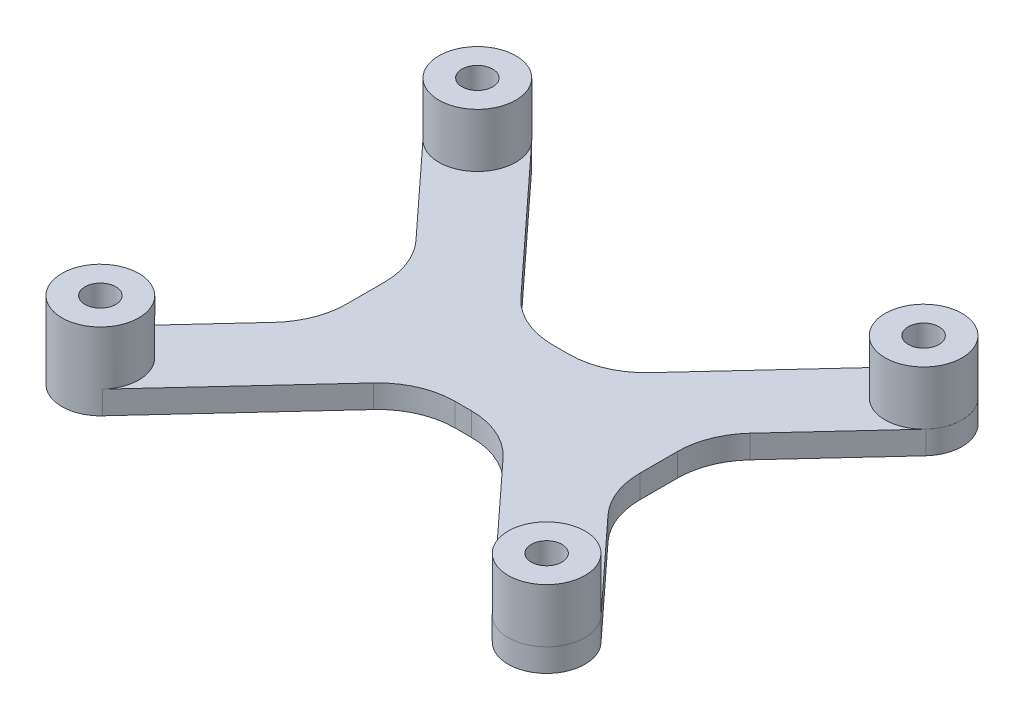
ISO-10303-21;
HEADER;
FILE_DESCRIPTION(('STEP AP214'),'2;1');
FILE_NAME('part.step','',(''),(''),'','','');
FILE_SCHEMA(('AUTOMOTIVE_DESIGN { 1 0 10303 214 1 1 1 1 }'));
ENDSEC;
DATA;
#1=APPLICATION_CONTEXT('core data for automotive mechanical design processes');
#2=APPLICATION_PROTOCOL_DEFINITION('international standard','automotive_design',2000,#1);
#3=PRODUCT_CONTEXT('',#1,'mechanical');
#4=PRODUCT('Part','Part','',(#3));
#5=PRODUCT_RELATED_PRODUCT_CATEGORY('part','',(#4));
#6=PRODUCT_DEFINITION_FORMATION('','',#4);
#7=PRODUCT_DEFINITION_CONTEXT('part definition',#1,'design');
#8=PRODUCT_DEFINITION('design','',#6,#7);
#9=PRODUCT_DEFINITION_SHAPE('','',#8);
#10=(LENGTH_UNIT() NAMED_UNIT(*) SI_UNIT(.MILLI.,.METRE.));
#11=(NAMED_UNIT(*) PLANE_ANGLE_UNIT() SI_UNIT($,.RADIAN.));
#12=(NAMED_UNIT(*) SI_UNIT($,.STERADIAN.) SOLID_ANGLE_UNIT());
#13=UNCERTAINTY_MEASURE_WITH_UNIT(LENGTH_MEASURE(1.E-05),#10,'distance_accuracy_value','');
#14=(GEOMETRIC_REPRESENTATION_CONTEXT(3) GLOBAL_UNCERTAINTY_ASSIGNED_CONTEXT((#13)) GLOBAL_UNIT_ASSIGNED_CONTEXT((#10,
#11,#12)) REPRESENTATION_CONTEXT('',''));
#15=CARTESIAN_POINT('',(0.,0.,0.));
#16=DIRECTION('',(0.,0.,1.));
#17=DIRECTION('',(1.,0.,0.));
#18=AXIS2_PLACEMENT_3D('',#15,#16,#17);
#19=CARTESIAN_POINT('',(29.,7.,24.5));
#20=DIRECTION('',(0.,-1.,0.));
#21=DIRECTION('',(0.,0.,-1.));
#22=AXIS2_PLACEMENT_3D('',#19,#20,#21);
#23=CYLINDRICAL_SURFACE('',#22,5.);
#24=CARTESIAN_POINT('',(29.,7.,24.5));
#25=DIRECTION('',(0.,1.,0.));
#26=DIRECTION('',(0.,0.,1.));
#27=AXIS2_PLACEMENT_3D('',#24,#25,#26);
#28=CIRCLE('',#27,5.);
#29=CARTESIAN_POINT('',(29.,7.,29.5));
#30=VERTEX_POINT('',#29);
#31=EDGE_CURVE('E56',#30,#30,#28,.T.);
#32=ORIENTED_EDGE('',*,*,#31,.F.);
#33=EDGE_LOOP('',(#32));
#34=FACE_BOUND('',#33,.T.);
#35=CARTESIAN_POINT('',(29.,0.,24.5));
#36=DIRECTION('',(0.,1.,0.));
#37=DIRECTION('',(0.,0.,1.));
#38=AXIS2_PLACEMENT_3D('',#35,#36,#37);
#39=CIRCLE('',#38,5.);
#40=CARTESIAN_POINT('',(29.,0.,29.5));
#41=VERTEX_POINT('',#40);
#42=EDGE_CURVE('E11',#41,#41,#39,.T.);
#43=ORIENTED_EDGE('',*,*,#42,.T.);
#44=EDGE_LOOP('',(#43));
#45=FACE_BOUND('',#44,.T.);
#46=ADVANCED_FACE('F52',(#34,#45),#23,.T.);
#47=CARTESIAN_POINT('',(29.,7.,24.5));
#48=DIRECTION('',(0.,1.,0.));
#49=DIRECTION('',(0.,0.,1.));
#50=AXIS2_PLACEMENT_3D('',#47,#48,#49);
#51=PLANE('',#50);
#52=CARTESIAN_POINT('',(29.,7.,24.5));
#53=DIRECTION('',(0.,1.,0.));
#54=DIRECTION('',(0.,0.,1.));
#55=AXIS2_PLACEMENT_3D('',#52,#53,#54);
#56=CIRCLE('',#55,2.);
#57=CARTESIAN_POINT('',(29.,7.,26.5));
#58=VERTEX_POINT('',#57);
#59=EDGE_CURVE('E63',#58,#58,#56,.T.);
#60=ORIENTED_EDGE('',*,*,#59,.F.);
#61=EDGE_LOOP('',(#60));
#62=FACE_BOUND('',#61,.T.);
#63=ORIENTED_EDGE('',*,*,#31,.T.);
#64=EDGE_LOOP('',(#63));
#65=FACE_BOUND('',#64,.T.);
#66=ADVANCED_FACE('F54',(#62,#65),#51,.T.);
#67=CARTESIAN_POINT('',(29.,0.,24.5));
#68=DIRECTION('',(0.,1.,0.));
#69=DIRECTION('',(0.,0.,1.));
#70=AXIS2_PLACEMENT_3D('',#67,#68,#69);
#71=PLANE('',#70);
#72=ORIENTED_EDGE('',*,*,#42,.F.);
#73=EDGE_LOOP('',(#72));
#74=FACE_BOUND('',#73,.T.);
#75=ADVANCED_FACE('F75',(#74),#71,.F.);
#76=CARTESIAN_POINT('',(29.,2.2,24.5));
#77=DIRECTION('',(0.,1.,0.));
#78=DIRECTION('',(0.,0.,1.));
#79=AXIS2_PLACEMENT_3D('',#76,#77,#78);
#80=CYLINDRICAL_SURFACE('',#79,2.);
#81=CARTESIAN_POINT('',(29.,2.2,24.5));
#82=DIRECTION('',(0.,1.,0.));
#83=DIRECTION('',(0.,0.,1.));
#84=AXIS2_PLACEMENT_3D('',#81,#82,#83);
#85=CIRCLE('',#84,2.);
#86=CARTESIAN_POINT('',(29.,2.2,26.5));
#87=VERTEX_POINT('',#86);
#88=EDGE_CURVE('E65',#87,#87,#85,.T.);
#89=ORIENTED_EDGE('',*,*,#88,.F.);
#90=EDGE_LOOP('',(#89));
#91=FACE_BOUND('',#90,.T.);
#92=ORIENTED_EDGE('',*,*,#59,.T.);
#93=EDGE_LOOP('',(#92));
#94=FACE_BOUND('',#93,.T.);
#95=ADVANCED_FACE('F71',(#91,#94),#80,.F.);
#96=CARTESIAN_POINT('',(29.,2.2,24.5));
#97=DIRECTION('',(0.,1.,0.));
#98=DIRECTION('',(0.,0.,1.));
#99=AXIS2_PLACEMENT_3D('',#96,#97,#98);
#100=PLANE('',#99);
#101=ORIENTED_EDGE('',*,*,#88,.T.);
#102=EDGE_LOOP('',(#101));
#103=FACE_BOUND('',#102,.T.);
#104=ADVANCED_FACE('F83',(#103),#100,.T.);
#105=CLOSED_SHELL('',(#46,#66,#75,#95,#104));
#106=MANIFOLD_SOLID_BREP('B2',#105);
#107=CARTESIAN_POINT('',(29.,7.,-24.5));
#108=DIRECTION('',(0.,-1.,0.));
#109=DIRECTION('',(0.,0.,-1.));
#110=AXIS2_PLACEMENT_3D('',#107,#108,#109);
#111=CYLINDRICAL_SURFACE('',#110,5.);
#112=CARTESIAN_POINT('',(29.,7.,-24.5));
#113=DIRECTION('',(0.,1.,0.));
#114=DIRECTION('',(0.,0.,1.));
#115=AXIS2_PLACEMENT_3D('',#112,#113,#114);
#116=CIRCLE('',#115,5.);
#117=CARTESIAN_POINT('',(29.,7.,-19.5));
#118=VERTEX_POINT('',#117);
#119=EDGE_CURVE('E147',#118,#118,#116,.T.);
#120=ORIENTED_EDGE('',*,*,#119,.F.);
#121=EDGE_LOOP('',(#120));
#122=FACE_BOUND('',#121,.T.);
#123=CARTESIAN_POINT('',(29.,0.,-24.5));
#124=DIRECTION('',(0.,1.,0.));
#125=DIRECTION('',(0.,0.,1.));
#126=AXIS2_PLACEMENT_3D('',#123,#124,#125);
#127=CIRCLE('',#126,5.);
#128=CARTESIAN_POINT('',(29.,0.,-19.5));
#129=VERTEX_POINT('',#128);
#130=EDGE_CURVE('E51',#129,#129,#127,.T.);
#131=ORIENTED_EDGE('',*,*,#130,.T.);
#132=EDGE_LOOP('',(#131));
#133=FACE_BOUND('',#132,.T.);
#134=ADVANCED_FACE('F143',(#122,#133),#111,.T.);
#135=CARTESIAN_POINT('',(29.,7.,-24.5));
#136=DIRECTION('',(0.,1.,0.));
#137=DIRECTION('',(0.,0.,1.));
#138=AXIS2_PLACEMENT_3D('',#135,#136,#137);
#139=PLANE('',#138);
#140=CARTESIAN_POINT('',(29.,7.,-24.5));
#141=DIRECTION('',(0.,1.,0.));
#142=DIRECTION('',(0.,0.,1.));
#143=AXIS2_PLACEMENT_3D('',#140,#141,#142);
#144=CIRCLE('',#143,2.);
#145=CARTESIAN_POINT('',(29.,7.,-22.5));
#146=VERTEX_POINT('',#145);
#147=EDGE_CURVE('E154',#146,#146,#144,.T.);
#148=ORIENTED_EDGE('',*,*,#147,.F.);
#149=EDGE_LOOP('',(#148));
#150=FACE_BOUND('',#149,.T.);
#151=ORIENTED_EDGE('',*,*,#119,.T.);
#152=EDGE_LOOP('',(#151));
#153=FACE_BOUND('',#152,.T.);
#154=ADVANCED_FACE('F145',(#150,#153),#139,.T.);
#155=CARTESIAN_POINT('',(29.,0.,-24.5));
#156=DIRECTION('',(0.,1.,0.));
#157=DIRECTION('',(0.,0.,1.));
#158=AXIS2_PLACEMENT_3D('',#155,#156,#157);
#159=PLANE('',#158);
#160=ORIENTED_EDGE('',*,*,#130,.F.);
#161=EDGE_LOOP('',(#160));
#162=FACE_BOUND('',#161,.T.);
#163=ADVANCED_FACE('F166',(#162),#159,.F.);
#164=CARTESIAN_POINT('',(29.,2.2,-24.5));
#165=DIRECTION('',(0.,1.,0.));
#166=DIRECTION('',(0.,0.,1.));
#167=AXIS2_PLACEMENT_3D('',#164,#165,#166);
#168=CYLINDRICAL_SURFACE('',#167,2.);
#169=CARTESIAN_POINT('',(29.,2.2,-24.5));
#170=DIRECTION('',(0.,1.,0.));
#171=DIRECTION('',(0.,0.,1.));
#172=AXIS2_PLACEMENT_3D('',#169,#170,#171);
#173=CIRCLE('',#172,2.);
#174=CARTESIAN_POINT('',(29.,2.2,-22.5));
#175=VERTEX_POINT('',#174);
#176=EDGE_CURVE('E156',#175,#175,#173,.T.);
#177=ORIENTED_EDGE('',*,*,#176,.F.);
#178=EDGE_LOOP('',(#177));
#179=FACE_BOUND('',#178,.T.);
#180=ORIENTED_EDGE('',*,*,#147,.T.);
#181=EDGE_LOOP('',(#180));
#182=FACE_BOUND('',#181,.T.);
#183=ADVANCED_FACE('F162',(#179,#182),#168,.F.);
#184=CARTESIAN_POINT('',(29.,2.2,-24.5));
#185=DIRECTION('',(0.,1.,0.));
#186=DIRECTION('',(0.,0.,1.));
#187=AXIS2_PLACEMENT_3D('',#184,#185,#186);
#188=PLANE('',#187);
#189=ORIENTED_EDGE('',*,*,#176,.T.);
#190=EDGE_LOOP('',(#189));
#191=FACE_BOUND('',#190,.T.);
#192=ADVANCED_FACE('F174',(#191),#188,.T.);
#193=CLOSED_SHELL('',(#134,#154,#163,#183,#192));
#194=MANIFOLD_SOLID_BREP('B6',#193);
#195=CARTESIAN_POINT('',(-19.05,-3.,-6.35));
#196=DIRECTION('',(0.,0.,-1.));
#197=DIRECTION('',(-1.,0.,0.));
#198=AXIS2_PLACEMENT_3D('',#195,#196,#197);
#199=PLANE('',#198);
#200=DIRECTION('',(-1.,0.,0.));
#201=VECTOR('',#200,1.);
#202=CARTESIAN_POINT('',(-19.05,-3.,-6.35));
#203=LINE('',#202,#201);
#204=CARTESIAN_POINT('',(1.0624383078741,-3.,-6.35));
#205=VERTEX_POINT('',#204);
#206=CARTESIAN_POINT('',(-1.06243830787411,-3.,-6.35));
#207=VERTEX_POINT('',#206);
#208=EDGE_CURVE('E500',#205,#207,#203,.T.);
#209=ORIENTED_EDGE('',*,*,#208,.T.);
#210=DIRECTION('',(0.,1.,0.));
#211=VECTOR('',#210,1.);
#212=CARTESIAN_POINT('',(-1.0624383078741,-3.,-6.35));
#213=LINE('',#212,#211);
#214=CARTESIAN_POINT('',(-1.06243830787411,0.,-6.35));
#215=VERTEX_POINT('',#214);
#216=EDGE_CURVE('E583',#207,#215,#213,.T.);
#217=ORIENTED_EDGE('',*,*,#216,.T.);
#218=DIRECTION('',(-1.,0.,0.));
#219=VECTOR('',#218,1.);
#220=CARTESIAN_POINT('',(-19.05,0.,-6.35));
#221=LINE('',#220,#219);
#222=CARTESIAN_POINT('',(1.0624383078741,0.,-6.35));
#223=VERTEX_POINT('',#222);
#224=EDGE_CURVE('E517',#223,#215,#221,.T.);
#225=ORIENTED_EDGE('',*,*,#224,.F.);
#226=DIRECTION('',(0.,1.,0.));
#227=VECTOR('',#226,1.);
#228=CARTESIAN_POINT('',(1.0624383078741,-3.,-6.35));
#229=LINE('',#228,#227);
#230=EDGE_CURVE('E580',#223,#205,#229,.F.);
#231=ORIENTED_EDGE('',*,*,#230,.T.);
#232=EDGE_LOOP('',(#209,#217,#225,#231));
#233=FACE_BOUND('',#232,.T.);
#234=ADVANCED_FACE('F231',(#233),#199,.T.);
#235=CARTESIAN_POINT('',(-19.05,-3.,6.35));
#236=DIRECTION('',(0.,0.,1.));
#237=DIRECTION('',(1.,0.,0.));
#238=AXIS2_PLACEMENT_3D('',#235,#236,#237);
#239=PLANE('',#238);
#240=DIRECTION('',(1.,0.,0.));
#241=VECTOR('',#240,1.);
#242=CARTESIAN_POINT('',(-19.05,-3.,6.35));
#243=LINE('',#242,#241);
#244=CARTESIAN_POINT('',(-1.06243830787411,-3.,6.35));
#245=VERTEX_POINT('',#244);
#246=CARTESIAN_POINT('',(1.0624383078741,-3.,6.35));
#247=VERTEX_POINT('',#246);
#248=EDGE_CURVE('E509',#245,#247,#243,.T.);
#249=ORIENTED_EDGE('',*,*,#248,.T.);
#250=DIRECTION('',(0.,1.,0.));
#251=VECTOR('',#250,1.);
#252=CARTESIAN_POINT('',(1.0624383078741,-3.,6.35));
#253=LINE('',#252,#251);
#254=CARTESIAN_POINT('',(1.0624383078741,0.,6.35));
#255=VERTEX_POINT('',#254);
#256=EDGE_CURVE('E611',#247,#255,#253,.T.);
#257=ORIENTED_EDGE('',*,*,#256,.T.);
#258=DIRECTION('',(1.,0.,0.));
#259=VECTOR('',#258,1.);
#260=CARTESIAN_POINT('',(-19.05,0.,6.35));
#261=LINE('',#260,#259);
#262=CARTESIAN_POINT('',(-1.06243830787411,0.,6.35));
#263=VERTEX_POINT('',#262);
#264=EDGE_CURVE('E501',#263,#255,#261,.T.);
#265=ORIENTED_EDGE('',*,*,#264,.F.);
#266=DIRECTION('',(0.,1.,0.));
#267=VECTOR('',#266,1.);
#268=CARTESIAN_POINT('',(-1.0624383078741,-3.,6.35));
#269=LINE('',#268,#267);
#270=EDGE_CURVE('E608',#263,#245,#269,.F.);
#271=ORIENTED_EDGE('',*,*,#270,.T.);
#272=EDGE_LOOP('',(#249,#257,#265,#271));
#273=FACE_BOUND('',#272,.T.);
#274=ADVANCED_FACE('F667',(#273),#239,.T.);
#275=CARTESIAN_POINT('',(-29.,7.,24.5));
#276=DIRECTION('',(0.,-1.,0.));
#277=DIRECTION('',(0.,0.,-1.));
#278=AXIS2_PLACEMENT_3D('',#275,#276,#277);
#279=CYLINDRICAL_SURFACE('',#278,5.);
#280=CARTESIAN_POINT('',(-29.,7.,24.5));
#281=DIRECTION('',(0.,1.,0.));
#282=DIRECTION('',(0.,0.,1.));
#283=AXIS2_PLACEMENT_3D('',#280,#281,#282);
#284=CIRCLE('',#283,5.);
#285=CARTESIAN_POINT('',(-29.,7.,29.5));
#286=VERTEX_POINT('',#285);
#287=EDGE_CURVE('E556',#286,#286,#284,.T.);
#288=ORIENTED_EDGE('',*,*,#287,.F.);
#289=EDGE_LOOP('',(#288));
#290=FACE_BOUND('',#289,.T.);
#291=CARTESIAN_POINT('',(-29.,0.,24.5));
#292=DIRECTION('',(0.,1.,0.));
#293=DIRECTION('',(0.,0.,1.));
#294=AXIS2_PLACEMENT_3D('',#291,#292,#293);
#295=CIRCLE('',#294,5.);
#296=CARTESIAN_POINT('',(-25.3260689597377,0.,27.8914938760666));
#297=VERTEX_POINT('',#296);
#298=CARTESIAN_POINT('',(-32.6739310402623,0.,21.1085061239334));
#299=VERTEX_POINT('',#298);
#300=EDGE_CURVE('E560',#297,#299,#295,.T.);
#301=ORIENTED_EDGE('',*,*,#300,.T.);
#302=DIRECTION('',(0.,1.,0.));
#303=VECTOR('',#302,1.);
#304=CARTESIAN_POINT('',(-32.6739310402623,-3.,21.1085061239334));
#305=LINE('',#304,#303);
#306=CARTESIAN_POINT('',(-32.6739310402623,-3.,21.1085061239334));
#307=VERTEX_POINT('',#306);
#308=EDGE_CURVE('E544',#307,#299,#305,.T.);
#309=ORIENTED_EDGE('',*,*,#308,.F.);
#310=CARTESIAN_POINT('',(-29.,-3.,24.5));
#311=DIRECTION('',(0.,1.,0.));
#312=DIRECTION('',(0.,0.,1.));
#313=AXIS2_PLACEMENT_3D('',#310,#311,#312);
#314=CIRCLE('',#313,5.);
#315=CARTESIAN_POINT('',(-25.3260689597377,-3.,27.8914938760666));
#316=VERTEX_POINT('',#315);
#317=EDGE_CURVE('E528',#316,#307,#314,.F.);
#318=ORIENTED_EDGE('',*,*,#317,.F.);
#319=DIRECTION('',(0.,1.,0.));
#320=VECTOR('',#319,1.);
#321=CARTESIAN_POINT('',(-25.3260689597377,-3.,27.8914938760666));
#322=LINE('',#321,#320);
#323=EDGE_CURVE('E538',#316,#297,#322,.T.);
#324=ORIENTED_EDGE('',*,*,#323,.T.);
#325=EDGE_LOOP('',(#301,#309,#318,#324));
#326=FACE_BOUND('',#325,.T.);
#327=ADVANCED_FACE('F676',(#290,#326),#279,.T.);
#328=CARTESIAN_POINT('',(-29.,7.,24.5));
#329=DIRECTION('',(0.,1.,0.));
#330=DIRECTION('',(0.,0.,1.));
#331=AXIS2_PLACEMENT_3D('',#328,#329,#330);
#332=PLANE('',#331);
#333=CARTESIAN_POINT('',(-29.,7.,24.5));
#334=DIRECTION('',(0.,1.,0.));
#335=DIRECTION('',(0.,0.,1.));
#336=AXIS2_PLACEMENT_3D('',#333,#334,#335);
#337=CIRCLE('',#336,2.);
#338=CARTESIAN_POINT('',(-29.,7.,26.5));
#339=VERTEX_POINT('',#338);
#340=EDGE_CURVE('E552',#339,#339,#337,.T.);
#341=ORIENTED_EDGE('',*,*,#340,.F.);
#342=EDGE_LOOP('',(#341));
#343=FACE_BOUND('',#342,.T.);
#344=ORIENTED_EDGE('',*,*,#287,.T.);
#345=EDGE_LOOP('',(#344));
#346=FACE_BOUND('',#345,.T.);
#347=ADVANCED_FACE('F777',(#343,#346),#332,.T.);
#348=CARTESIAN_POINT('',(-29.,2.2,24.5));
#349=DIRECTION('',(0.,1.,0.));
#350=DIRECTION('',(0.,0.,1.));
#351=AXIS2_PLACEMENT_3D('',#348,#349,#350);
#352=CYLINDRICAL_SURFACE('',#351,2.);
#353=CARTESIAN_POINT('',(-29.,2.2,24.5));
#354=DIRECTION('',(0.,1.,0.));
#355=DIRECTION('',(0.,0.,1.));
#356=AXIS2_PLACEMENT_3D('',#353,#354,#355);
#357=CIRCLE('',#356,2.);
#358=CARTESIAN_POINT('',(-29.,2.2,26.5));
#359=VERTEX_POINT('',#358);
#360=EDGE_CURVE('E548',#359,#359,#357,.T.);
#361=ORIENTED_EDGE('',*,*,#360,.F.);
#362=EDGE_LOOP('',(#361));
#363=FACE_BOUND('',#362,.T.);
#364=ORIENTED_EDGE('',*,*,#340,.T.);
#365=EDGE_LOOP('',(#364));
#366=FACE_BOUND('',#365,.T.);
#367=ADVANCED_FACE('F774',(#363,#366),#352,.F.);
#368=CARTESIAN_POINT('',(-29.,2.2,24.5));
#369=DIRECTION('',(0.,1.,0.));
#370=DIRECTION('',(0.,0.,1.));
#371=AXIS2_PLACEMENT_3D('',#368,#369,#370);
#372=PLANE('',#371);
#373=ORIENTED_EDGE('',*,*,#360,.T.);
#374=EDGE_LOOP('',(#373));
#375=FACE_BOUND('',#374,.T.);
#376=ADVANCED_FACE('F769',(#375),#372,.T.);
#377=CARTESIAN_POINT('',(0.,0.,0.));
#378=DIRECTION('',(0.,1.,0.));
#379=DIRECTION('',(0.,0.,1.));
#380=AXIS2_PLACEMENT_3D('',#377,#378,#379);
#381=PLANE('',#380);
#382=ORIENTED_EDGE('',*,*,#300,.F.);
#383=DIRECTION('',(0.678298775213327,0.,-0.734786208052451));
#384=VECTOR('',#383,1.);
#385=CARTESIAN_POINT('',(0.227430997141103,0.,0.209947009233118));
#386=LINE('',#385,#384);
#387=CARTESIAN_POINT('',(-8.41030038839862,0.,9.56701224786673));
#388=VERTEX_POINT('',#387);
#389=EDGE_CURVE('E513',#297,#388,#386,.T.);
#390=ORIENTED_EDGE('',*,*,#389,.T.);
#391=CARTESIAN_POINT('',(-1.0624383078741,0.,16.35));
#392=DIRECTION('',(0.,1.,0.));
#393=DIRECTION('',(0.,0.,1.));
#394=AXIS2_PLACEMENT_3D('',#391,#392,#393);
#395=CIRCLE('',#394,10.);
#396=EDGE_CURVE('E240',#388,#263,#395,.F.);
#397=ORIENTED_EDGE('',*,*,#396,.T.);
#398=ORIENTED_EDGE('',*,*,#264,.T.);
#399=CARTESIAN_POINT('',(1.0624383078741,0.,16.35));
#400=DIRECTION('',(0.,1.,0.));
#401=DIRECTION('',(0.,0.,1.));
#402=AXIS2_PLACEMENT_3D('',#399,#400,#401);
#403=CIRCLE('',#402,10.);
#404=CARTESIAN_POINT('',(8.41030038839862,0.,9.56701224786673));
#405=VERTEX_POINT('',#404);
#406=EDGE_CURVE('E656',#255,#405,#403,.F.);
#407=ORIENTED_EDGE('',*,*,#406,.T.);
#408=DIRECTION('',(-0.678298775213327,0.,-0.734786208052451));
#409=VECTOR('',#408,1.);
#410=CARTESIAN_POINT('',(-0.227430997141103,0.,0.209947009233118));
#411=LINE('',#410,#409);
#412=CARTESIAN_POINT('',(25.3260689597377,0.,27.8914938760666));
#413=VERTEX_POINT('',#412);
#414=EDGE_CURVE('E472',#413,#405,#411,.T.);
#415=ORIENTED_EDGE('',*,*,#414,.F.);
#416=CARTESIAN_POINT('',(29.,0.,24.5));
#417=DIRECTION('',(0.,-1.,0.));
#418=DIRECTION('',(0.,0.,1.));
#419=AXIS2_PLACEMENT_3D('',#416,#417,#418);
#420=CIRCLE('',#419,5.);
#421=CARTESIAN_POINT('',(32.6739310402623,0.,21.1085061239334));
#422=VERTEX_POINT('',#421);
#423=EDGE_CURVE('E464',#413,#422,#420,.F.);
#424=ORIENTED_EDGE('',*,*,#423,.T.);
#425=DIRECTION('',(0.678298775213327,0.,0.734786208052451));
#426=VECTOR('',#425,1.);
#427=CARTESIAN_POINT('',(7.12043108338341,0.,-6.57304074290015));
#428=LINE('',#427,#426);
#429=CARTESIAN_POINT('',(21.7021379194755,0.,9.22300292481085));
#430=VERTEX_POINT('',#429);
#431=EDGE_CURVE('E483',#430,#422,#428,.T.);
#432=ORIENTED_EDGE('',*,*,#431,.F.);
#433=CARTESIAN_POINT('',(29.05,0.,2.44001517267758));
#434=DIRECTION('',(0.,1.,0.));
#435=DIRECTION('',(0.,0.,1.));
#436=AXIS2_PLACEMENT_3D('',#433,#434,#435);
#437=CIRCLE('',#436,10.);
#438=CARTESIAN_POINT('',(19.05,0.,2.44001517267758));
#439=VERTEX_POINT('',#438);
#440=EDGE_CURVE('E650',#430,#439,#437,.F.);
#441=ORIENTED_EDGE('',*,*,#440,.T.);
#442=DIRECTION('',(0.,0.,-1.));
#443=VECTOR('',#442,1.);
#444=CARTESIAN_POINT('',(19.05,0.,6.35));
#445=LINE('',#444,#443);
#446=CARTESIAN_POINT('',(19.05,0.,-2.44001517267757));
#447=VERTEX_POINT('',#446);
#448=EDGE_CURVE('E492',#439,#447,#445,.T.);
#449=ORIENTED_EDGE('',*,*,#448,.T.);
#450=CARTESIAN_POINT('',(29.05,0.,-2.44001517267757));
#451=DIRECTION('',(0.,1.,0.));
#452=DIRECTION('',(0.,0.,1.));
#453=AXIS2_PLACEMENT_3D('',#450,#451,#452);
#454=CIRCLE('',#453,10.);
#455=CARTESIAN_POINT('',(21.7021379194755,0.,-9.22300292481085));
#456=VERTEX_POINT('',#455);
#457=EDGE_CURVE('E644',#447,#456,#454,.F.);
#458=ORIENTED_EDGE('',*,*,#457,.T.);
#459=DIRECTION('',(0.678298775213327,0.,-0.734786208052451));
#460=VECTOR('',#459,1.);
#461=CARTESIAN_POINT('',(7.12043108338341,0.,6.57304074290015));
#462=LINE('',#461,#460);
#463=CARTESIAN_POINT('',(32.6739310402623,0.,-21.1085061239334));
#464=VERTEX_POINT('',#463);
#465=EDGE_CURVE('E443',#456,#464,#462,.T.);
#466=ORIENTED_EDGE('',*,*,#465,.T.);
#467=CARTESIAN_POINT('',(29.,0.,-24.5));
#468=DIRECTION('',(0.,1.,0.));
#469=DIRECTION('',(0.,0.,-1.));
#470=AXIS2_PLACEMENT_3D('',#467,#468,#469);
#471=CIRCLE('',#470,5.);
#472=CARTESIAN_POINT('',(25.3260689597377,0.,-27.8914938760666));
#473=VERTEX_POINT('',#472);
#474=EDGE_CURVE('E436',#473,#464,#471,.F.);
#475=ORIENTED_EDGE('',*,*,#474,.F.);
#476=DIRECTION('',(-0.678298775213327,0.,0.734786208052451));
#477=VECTOR('',#476,1.);
#478=CARTESIAN_POINT('',(-0.227430997141103,0.,-0.209947009233118));
#479=LINE('',#478,#477);
#480=CARTESIAN_POINT('',(8.41030038839862,0.,-9.56701224786673));
#481=VERTEX_POINT('',#480);
#482=EDGE_CURVE('E454',#473,#481,#479,.T.);
#483=ORIENTED_EDGE('',*,*,#482,.T.);
#484=CARTESIAN_POINT('',(1.0624383078741,0.,-16.35));
#485=DIRECTION('',(0.,1.,0.));
#486=DIRECTION('',(0.,0.,1.));
#487=AXIS2_PLACEMENT_3D('',#484,#485,#486);
#488=CIRCLE('',#487,10.);
#489=EDGE_CURVE('E638',#481,#223,#488,.F.);
#490=ORIENTED_EDGE('',*,*,#489,.T.);
#491=ORIENTED_EDGE('',*,*,#224,.T.);
#492=CARTESIAN_POINT('',(-1.0624383078741,0.,-16.35));
#493=DIRECTION('',(0.,1.,0.));
#494=DIRECTION('',(0.,0.,1.));
#495=AXIS2_PLACEMENT_3D('',#492,#493,#494);
#496=CIRCLE('',#495,10.);
#497=CARTESIAN_POINT('',(-8.41030038839862,0.,-9.56701224786673));
#498=VERTEX_POINT('',#497);
#499=EDGE_CURVE('E632',#215,#498,#496,.F.);
#500=ORIENTED_EDGE('',*,*,#499,.T.);
#501=DIRECTION('',(0.678298775213327,0.,0.734786208052451));
#502=VECTOR('',#501,1.);
#503=CARTESIAN_POINT('',(0.227430997141103,0.,-0.209947009233118));
#504=LINE('',#503,#502);
#505=CARTESIAN_POINT('',(-25.3260689597377,0.,-27.8914938760666));
#506=VERTEX_POINT('',#505);
#507=EDGE_CURVE('E422',#506,#498,#504,.T.);
#508=ORIENTED_EDGE('',*,*,#507,.F.);
#509=CARTESIAN_POINT('',(-29.,0.,-24.5));
#510=DIRECTION('',(0.,-1.,0.));
#511=DIRECTION('',(0.,0.,-1.));
#512=AXIS2_PLACEMENT_3D('',#509,#510,#511);
#513=CIRCLE('',#512,5.);
#514=CARTESIAN_POINT('',(-32.6739310402623,0.,-21.1085061239334));
#515=VERTEX_POINT('',#514);
#516=EDGE_CURVE('E430',#506,#515,#513,.F.);
#517=ORIENTED_EDGE('',*,*,#516,.T.);
#518=DIRECTION('',(-0.678298775213327,0.,-0.734786208052451));
#519=VECTOR('',#518,1.);
#520=CARTESIAN_POINT('',(-7.12043108338341,0.,6.57304074290015));
#521=LINE('',#520,#519);
#522=CARTESIAN_POINT('',(-21.7021379194755,0.,-9.22300292481085));
#523=VERTEX_POINT('',#522);
#524=EDGE_CURVE('E412',#523,#515,#521,.T.);
#525=ORIENTED_EDGE('',*,*,#524,.F.);
#526=CARTESIAN_POINT('',(-29.05,0.,-2.44001517267758));
#527=DIRECTION('',(0.,1.,0.));
#528=DIRECTION('',(0.,0.,1.));
#529=AXIS2_PLACEMENT_3D('',#526,#527,#528);
#530=CIRCLE('',#529,10.);
#531=CARTESIAN_POINT('',(-19.05,0.,-2.44001517267758));
#532=VERTEX_POINT('',#531);
#533=EDGE_CURVE('E627',#523,#532,#530,.F.);
#534=ORIENTED_EDGE('',*,*,#533,.T.);
#535=DIRECTION('',(0.,0.,1.));
#536=VECTOR('',#535,1.);
#537=CARTESIAN_POINT('',(-19.05,0.,6.35));
#538=LINE('',#537,#536);
#539=CARTESIAN_POINT('',(-19.05,0.,2.44001517267758));
#540=VERTEX_POINT('',#539);
#541=EDGE_CURVE('E521',#532,#540,#538,.T.);
#542=ORIENTED_EDGE('',*,*,#541,.T.);
#543=CARTESIAN_POINT('',(-29.05,0.,2.44001517267758));
#544=DIRECTION('',(0.,1.,0.));
#545=DIRECTION('',(0.,0.,1.));
#546=AXIS2_PLACEMENT_3D('',#543,#544,#545);
#547=CIRCLE('',#546,10.);
#548=CARTESIAN_POINT('',(-21.7021379194755,0.,9.22300292481085));
#549=VERTEX_POINT('',#548);
#550=EDGE_CURVE('E621',#540,#549,#547,.F.);
#551=ORIENTED_EDGE('',*,*,#550,.T.);
#552=DIRECTION('',(-0.678298775213327,0.,0.734786208052451));
#553=VECTOR('',#552,1.);
#554=CARTESIAN_POINT('',(-7.12043108338341,0.,-6.57304074290015));
#555=LINE('',#554,#553);
#556=EDGE_CURVE('E532',#549,#299,#555,.T.);
#557=ORIENTED_EDGE('',*,*,#556,.T.);
#558=EDGE_LOOP('',(#382,#390,#397,#398,#407,#415,#424,#432,#441,#449,#458,#466,#475,#483,#490,
#491,#500,#508,#517,#525,#534,#542,#551,#557));
#559=FACE_BOUND('',#558,.T.);
#560=ADVANCED_FACE('F665',(#559),#381,.T.);
#561=CARTESIAN_POINT('',(-7.12043108338341,-3.,-6.57304074290015));
#562=DIRECTION('',(-0.734786208052451,0.,-0.678298775213327));
#563=DIRECTION('',(-0.678298775213327,0.,0.734786208052451));
#564=AXIS2_PLACEMENT_3D('',#561,#562,#563);
#565=PLANE('',#564);
#566=ORIENTED_EDGE('',*,*,#556,.F.);
#567=DIRECTION('',(0.,1.,0.));
#568=VECTOR('',#567,1.);
#569=CARTESIAN_POINT('',(-21.7021379194755,-3.,9.22300292481085));
#570=LINE('',#569,#568);
#571=CARTESIAN_POINT('',(-21.7021379194755,-3.,9.22300292481085));
#572=VERTEX_POINT('',#571);
#573=EDGE_CURVE('E574',#549,#572,#570,.F.);
#574=ORIENTED_EDGE('',*,*,#573,.T.);
#575=DIRECTION('',(-0.678298775213327,0.,0.734786208052451));
#576=VECTOR('',#575,1.);
#577=CARTESIAN_POINT('',(-7.12043108338341,-3.,-6.57304074290015));
#578=LINE('',#577,#576);
#579=EDGE_CURVE('E535',#572,#307,#578,.T.);
#580=ORIENTED_EDGE('',*,*,#579,.T.);
#581=ORIENTED_EDGE('',*,*,#308,.T.);
#582=EDGE_LOOP('',(#566,#574,#580,#581));
#583=FACE_BOUND('',#582,.T.);
#584=ADVANCED_FACE('F679',(#583),#565,.T.);
#585=CARTESIAN_POINT('',(0.227430997141103,-3.,0.209947009233118));
#586=DIRECTION('',(0.734786208052451,0.,0.678298775213327));
#587=DIRECTION('',(0.678298775213327,0.,-0.734786208052451));
#588=AXIS2_PLACEMENT_3D('',#585,#586,#587);
#589=PLANE('',#588);
#590=DIRECTION('',(0.678298775213327,0.,-0.734786208052451));
#591=VECTOR('',#590,1.);
#592=CARTESIAN_POINT('',(0.227430997141103,-3.,0.209947009233118));
#593=LINE('',#592,#591);
#594=CARTESIAN_POINT('',(-8.41030038839862,-3.,9.56701224786673));
#595=VERTEX_POINT('',#594);
#596=EDGE_CURVE('E531',#316,#595,#593,.T.);
#597=ORIENTED_EDGE('',*,*,#596,.T.);
#598=DIRECTION('',(0.,1.,0.));
#599=VECTOR('',#598,1.);
#600=CARTESIAN_POINT('',(-8.41030038839862,0.,9.56701224786673));
#601=LINE('',#600,#599);
#602=EDGE_CURVE('E618',#595,#388,#601,.T.);
#603=ORIENTED_EDGE('',*,*,#602,.T.);
#604=ORIENTED_EDGE('',*,*,#389,.F.);
#605=ORIENTED_EDGE('',*,*,#323,.F.);
#606=EDGE_LOOP('',(#597,#603,#604,#605));
#607=FACE_BOUND('',#606,.T.);
#608=ADVANCED_FACE('F670',(#607),#589,.T.);
#609=CARTESIAN_POINT('',(0.,-3.,0.));
#610=DIRECTION('',(0.,1.,0.));
#611=DIRECTION('',(0.,0.,1.));
#612=AXIS2_PLACEMENT_3D('',#609,#610,#611);
#613=PLANE('',#612);
#614=ORIENTED_EDGE('',*,*,#317,.T.);
#615=ORIENTED_EDGE('',*,*,#579,.F.);
#616=CARTESIAN_POINT('',(-29.05,-3.,2.44001517267758));
#617=DIRECTION('',(0.,1.,0.));
#618=DIRECTION('',(0.,0.,1.));
#619=AXIS2_PLACEMENT_3D('',#616,#617,#618);
#620=CIRCLE('',#619,10.);
#621=CARTESIAN_POINT('',(-19.05,-3.,2.44001517267758));
#622=VERTEX_POINT('',#621);
#623=EDGE_CURVE('E624',#572,#622,#620,.T.);
#624=ORIENTED_EDGE('',*,*,#623,.T.);
#625=DIRECTION('',(0.,0.,1.));
#626=VECTOR('',#625,1.);
#627=CARTESIAN_POINT('',(-19.05,-3.,6.35));
#628=LINE('',#627,#626);
#629=CARTESIAN_POINT('',(-19.05,-3.,-2.44001517267758));
#630=VERTEX_POINT('',#629);
#631=EDGE_CURVE('E505',#630,#622,#628,.T.);
#632=ORIENTED_EDGE('',*,*,#631,.F.);
#633=CARTESIAN_POINT('',(-29.05,-3.,-2.44001517267758));
#634=DIRECTION('',(0.,1.,0.));
#635=DIRECTION('',(0.,0.,1.));
#636=AXIS2_PLACEMENT_3D('',#633,#634,#635);
#637=CIRCLE('',#636,10.);
#638=CARTESIAN_POINT('',(-21.7021379194755,-3.,-9.22300292481085));
#639=VERTEX_POINT('',#638);
#640=EDGE_CURVE('E401',#630,#639,#637,.T.);
#641=ORIENTED_EDGE('',*,*,#640,.T.);
#642=DIRECTION('',(-0.678298775213327,0.,-0.734786208052451));
#643=VECTOR('',#642,1.);
#644=CARTESIAN_POINT('',(-7.12043108338341,-3.,6.57304074290015));
#645=LINE('',#644,#643);
#646=CARTESIAN_POINT('',(-32.6739310402623,-3.,-21.1085061239334));
#647=VERTEX_POINT('',#646);
#648=EDGE_CURVE('E392',#639,#647,#645,.T.);
#649=ORIENTED_EDGE('',*,*,#648,.T.);
#650=CARTESIAN_POINT('',(-29.,-3.,-24.5));
#651=DIRECTION('',(0.,-1.,0.));
#652=DIRECTION('',(0.,0.,-1.));
#653=AXIS2_PLACEMENT_3D('',#650,#651,#652);
#654=CIRCLE('',#653,5.);
#655=CARTESIAN_POINT('',(-25.3260689597377,-3.,-27.8914938760666));
#656=VERTEX_POINT('',#655);
#657=EDGE_CURVE('E398',#656,#647,#654,.F.);
#658=ORIENTED_EDGE('',*,*,#657,.F.);
#659=DIRECTION('',(0.678298775213327,0.,0.734786208052451));
#660=VECTOR('',#659,1.);
#661=CARTESIAN_POINT('',(0.227430997141103,-3.,-0.209947009233118));
#662=LINE('',#661,#660);
#663=CARTESIAN_POINT('',(-8.41030038839862,-3.,-9.56701224786673));
#664=VERTEX_POINT('',#663);
#665=EDGE_CURVE('E406',#656,#664,#662,.T.);
#666=ORIENTED_EDGE('',*,*,#665,.T.);
#667=CARTESIAN_POINT('',(-1.0624383078741,-3.,-16.35));
#668=DIRECTION('',(0.,1.,0.));
#669=DIRECTION('',(0.,0.,1.));
#670=AXIS2_PLACEMENT_3D('',#667,#668,#669);
#671=CIRCLE('',#670,10.);
#672=EDGE_CURVE('E635',#664,#207,#671,.T.);
#673=ORIENTED_EDGE('',*,*,#672,.T.);
#674=ORIENTED_EDGE('',*,*,#208,.F.);
#675=CARTESIAN_POINT('',(1.0624383078741,-3.,-16.35));
#676=DIRECTION('',(0.,1.,0.));
#677=DIRECTION('',(0.,0.,1.));
#678=AXIS2_PLACEMENT_3D('',#675,#676,#677);
#679=CIRCLE('',#678,10.);
#680=CARTESIAN_POINT('',(8.41030038839862,-3.,-9.56701224786673));
#681=VERTEX_POINT('',#680);
#682=EDGE_CURVE('E641',#205,#681,#679,.T.);
#683=ORIENTED_EDGE('',*,*,#682,.T.);
#684=DIRECTION('',(-0.678298775213327,0.,0.734786208052451));
#685=VECTOR('',#684,1.);
#686=CARTESIAN_POINT('',(-0.227430997141103,-3.,-0.209947009233118));
#687=LINE('',#686,#685);
#688=CARTESIAN_POINT('',(25.3260689597377,-3.,-27.8914938760666));
#689=VERTEX_POINT('',#688);
#690=EDGE_CURVE('E442',#689,#681,#687,.T.);
#691=ORIENTED_EDGE('',*,*,#690,.F.);
#692=CARTESIAN_POINT('',(29.,-3.,-24.5));
#693=DIRECTION('',(0.,1.,0.));
#694=DIRECTION('',(0.,0.,-1.));
#695=AXIS2_PLACEMENT_3D('',#692,#693,#694);
#696=CIRCLE('',#695,5.);
#697=CARTESIAN_POINT('',(32.6739310402623,-3.,-21.1085061239334));
#698=VERTEX_POINT('',#697);
#699=EDGE_CURVE('E438',#689,#698,#696,.F.);
#700=ORIENTED_EDGE('',*,*,#699,.T.);
#701=DIRECTION('',(0.678298775213327,0.,-0.734786208052451));
#702=VECTOR('',#701,1.);
#703=CARTESIAN_POINT('',(7.12043108338341,-3.,6.57304074290015));
#704=LINE('',#703,#702);
#705=CARTESIAN_POINT('',(21.7021379194755,-3.,-9.22300292481085));
#706=VERTEX_POINT('',#705);
#707=EDGE_CURVE('E447',#706,#698,#704,.T.);
#708=ORIENTED_EDGE('',*,*,#707,.F.);
#709=CARTESIAN_POINT('',(29.05,-3.,-2.44001517267757));
#710=DIRECTION('',(0.,1.,0.));
#711=DIRECTION('',(0.,0.,1.));
#712=AXIS2_PLACEMENT_3D('',#709,#710,#711);
#713=CIRCLE('',#712,10.);
#714=CARTESIAN_POINT('',(19.05,-3.,-2.44001517267757));
#715=VERTEX_POINT('',#714);
#716=EDGE_CURVE('E647',#706,#715,#713,.T.);
#717=ORIENTED_EDGE('',*,*,#716,.T.);
#718=DIRECTION('',(0.,0.,-1.));
#719=VECTOR('',#718,1.);
#720=CARTESIAN_POINT('',(19.05,-3.,6.35));
#721=LINE('',#720,#719);
#722=CARTESIAN_POINT('',(19.05,-3.,2.44001517267758));
#723=VERTEX_POINT('',#722);
#724=EDGE_CURVE('E496',#723,#715,#721,.T.);
#725=ORIENTED_EDGE('',*,*,#724,.F.);
#726=CARTESIAN_POINT('',(29.05,-3.,2.44001517267758));
#727=DIRECTION('',(0.,1.,0.));
#728=DIRECTION('',(0.,0.,1.));
#729=AXIS2_PLACEMENT_3D('',#726,#727,#728);
#730=CIRCLE('',#729,10.);
#731=CARTESIAN_POINT('',(21.7021379194755,-3.,9.22300292481085));
#732=VERTEX_POINT('',#731);
#733=EDGE_CURVE('E653',#723,#732,#730,.T.);
#734=ORIENTED_EDGE('',*,*,#733,.T.);
#735=DIRECTION('',(0.678298775213327,0.,0.734786208052451));
#736=VECTOR('',#735,1.);
#737=CARTESIAN_POINT('',(7.12043108338341,-3.,-6.57304074290015));
#738=LINE('',#737,#736);
#739=CARTESIAN_POINT('',(32.6739310402623,-3.,21.1085061239334));
#740=VERTEX_POINT('',#739);
#741=EDGE_CURVE('E471',#732,#740,#738,.T.);
#742=ORIENTED_EDGE('',*,*,#741,.T.);
#743=CARTESIAN_POINT('',(29.,-3.,24.5));
#744=DIRECTION('',(0.,-1.,0.));
#745=DIRECTION('',(0.,0.,1.));
#746=AXIS2_PLACEMENT_3D('',#743,#744,#745);
#747=CIRCLE('',#746,5.);
#748=CARTESIAN_POINT('',(25.3260689597377,-3.,27.8914938760666));
#749=VERTEX_POINT('',#748);
#750=EDGE_CURVE('E467',#749,#740,#747,.F.);
#751=ORIENTED_EDGE('',*,*,#750,.F.);
#752=DIRECTION('',(-0.678298775213327,0.,-0.734786208052451));
#753=VECTOR('',#752,1.);
#754=CARTESIAN_POINT('',(-0.227430997141103,-3.,0.209947009233118));
#755=LINE('',#754,#753);
#756=CARTESIAN_POINT('',(8.41030038839862,-3.,9.56701224786673));
#757=VERTEX_POINT('',#756);
#758=EDGE_CURVE('E475',#749,#757,#755,.T.);
#759=ORIENTED_EDGE('',*,*,#758,.T.);
#760=CARTESIAN_POINT('',(1.0624383078741,-3.,16.35));
#761=DIRECTION('',(0.,1.,0.));
#762=DIRECTION('',(0.,0.,1.));
#763=AXIS2_PLACEMENT_3D('',#760,#761,#762);
#764=CIRCLE('',#763,10.);
#765=EDGE_CURVE('E659',#757,#247,#764,.T.);
#766=ORIENTED_EDGE('',*,*,#765,.T.);
#767=ORIENTED_EDGE('',*,*,#248,.F.);
#768=CARTESIAN_POINT('',(-1.0624383078741,-3.,16.35));
#769=DIRECTION('',(0.,1.,0.));
#770=DIRECTION('',(0.,0.,1.));
#771=AXIS2_PLACEMENT_3D('',#768,#769,#770);
#772=CIRCLE('',#771,10.);
#773=EDGE_CURVE('E141',#245,#595,#772,.T.);
#774=ORIENTED_EDGE('',*,*,#773,.T.);
#775=ORIENTED_EDGE('',*,*,#596,.F.);
#776=EDGE_LOOP('',(#614,#615,#624,#632,#641,#649,#658,#666,#673,#674,#683,#691,#700,#708,#717,
#725,#734,#742,#751,#759,#766,#767,#774,#775));
#777=FACE_BOUND('',#776,.T.);
#778=ADVANCED_FACE('F395',(#777),#613,.F.);
#779=CARTESIAN_POINT('',(19.05,-3.,6.35));
#780=DIRECTION('',(1.,0.,0.));
#781=DIRECTION('',(0.,0.,-1.));
#782=AXIS2_PLACEMENT_3D('',#779,#780,#781);
#783=PLANE('',#782);
#784=ORIENTED_EDGE('',*,*,#724,.T.);
#785=DIRECTION('',(0.,1.,0.));
#786=VECTOR('',#785,1.);
#787=CARTESIAN_POINT('',(19.05,0.,-2.44001517267757));
#788=LINE('',#787,#786);
#789=EDGE_CURVE('E597',#715,#447,#788,.T.);
#790=ORIENTED_EDGE('',*,*,#789,.T.);
#791=ORIENTED_EDGE('',*,*,#448,.F.);
#792=DIRECTION('',(0.,1.,0.));
#793=VECTOR('',#792,1.);
#794=CARTESIAN_POINT('',(19.05,-3.,2.44001517267758));
#795=LINE('',#794,#793);
#796=EDGE_CURVE('E594',#439,#723,#795,.F.);
#797=ORIENTED_EDGE('',*,*,#796,.T.);
#798=EDGE_LOOP('',(#784,#790,#791,#797));
#799=FACE_BOUND('',#798,.T.);
#800=ADVANCED_FACE('F725',(#799),#783,.T.);
#801=CARTESIAN_POINT('',(-19.05,-3.,6.35));
#802=DIRECTION('',(-1.,0.,0.));
#803=DIRECTION('',(0.,0.,1.));
#804=AXIS2_PLACEMENT_3D('',#801,#802,#803);
#805=PLANE('',#804);
#806=ORIENTED_EDGE('',*,*,#631,.T.);
#807=DIRECTION('',(0.,1.,0.));
#808=VECTOR('',#807,1.);
#809=CARTESIAN_POINT('',(-19.05,0.,2.44001517267758));
#810=LINE('',#809,#808);
#811=EDGE_CURVE('E570',#622,#540,#810,.T.);
#812=ORIENTED_EDGE('',*,*,#811,.T.);
#813=ORIENTED_EDGE('',*,*,#541,.F.);
#814=DIRECTION('',(0.,1.,0.));
#815=VECTOR('',#814,1.);
#816=CARTESIAN_POINT('',(-19.05,-3.,-2.44001517267758));
#817=LINE('',#816,#815);
#818=EDGE_CURVE('E564',#532,#630,#817,.F.);
#819=ORIENTED_EDGE('',*,*,#818,.T.);
#820=EDGE_LOOP('',(#806,#812,#813,#819));
#821=FACE_BOUND('',#820,.T.);
#822=ADVANCED_FACE('F685',(#821),#805,.T.);
#823=CARTESIAN_POINT('',(29.,-3.,24.5));
#824=DIRECTION('',(0.,1.,0.));
#825=DIRECTION('',(0.,0.,1.));
#826=AXIS2_PLACEMENT_3D('',#823,#824,#825);
#827=CYLINDRICAL_SURFACE('',#826,5.);
#828=ORIENTED_EDGE('',*,*,#423,.F.);
#829=DIRECTION('',(0.,1.,0.));
#830=VECTOR('',#829,1.);
#831=CARTESIAN_POINT('',(25.3260689597377,-3.,27.8914938760666));
#832=LINE('',#831,#830);
#833=EDGE_CURVE('E489',#749,#413,#832,.T.);
#834=ORIENTED_EDGE('',*,*,#833,.F.);
#835=ORIENTED_EDGE('',*,*,#750,.T.);
#836=DIRECTION('',(0.,1.,0.));
#837=VECTOR('',#836,1.);
#838=CARTESIAN_POINT('',(32.6739310402623,-3.,21.1085061239334));
#839=LINE('',#838,#837);
#840=EDGE_CURVE('E479',#740,#422,#839,.T.);
#841=ORIENTED_EDGE('',*,*,#840,.T.);
#842=EDGE_LOOP('',(#828,#834,#835,#841));
#843=FACE_BOUND('',#842,.T.);
#844=ADVANCED_FACE('F742',(#843),#827,.T.);
#845=CARTESIAN_POINT('',(-0.227430997141103,-3.,0.209947009233118));
#846=DIRECTION('',(0.734786208052451,0.,-0.678298775213327));
#847=DIRECTION('',(-0.678298775213327,0.,-0.734786208052451));
#848=AXIS2_PLACEMENT_3D('',#845,#846,#847);
#849=PLANE('',#848);
#850=ORIENTED_EDGE('',*,*,#414,.T.);
#851=DIRECTION('',(0.,1.,0.));
#852=VECTOR('',#851,1.);
#853=CARTESIAN_POINT('',(8.41030038839862,-3.,9.56701224786673));
#854=LINE('',#853,#852);
#855=EDGE_CURVE('E615',#405,#757,#854,.F.);
#856=ORIENTED_EDGE('',*,*,#855,.T.);
#857=ORIENTED_EDGE('',*,*,#758,.F.);
#858=ORIENTED_EDGE('',*,*,#833,.T.);
#859=EDGE_LOOP('',(#850,#856,#857,#858));
#860=FACE_BOUND('',#859,.T.);
#861=ADVANCED_FACE('F745',(#860),#849,.F.);
#862=CARTESIAN_POINT('',(7.12043108338341,-3.,-6.57304074290015));
#863=DIRECTION('',(-0.734786208052451,0.,0.678298775213327));
#864=DIRECTION('',(0.678298775213327,0.,0.734786208052451));
#865=AXIS2_PLACEMENT_3D('',#862,#863,#864);
#866=PLANE('',#865);
#867=ORIENTED_EDGE('',*,*,#741,.F.);
#868=DIRECTION('',(0.,1.,0.));
#869=VECTOR('',#868,1.);
#870=CARTESIAN_POINT('',(21.7021379194755,-3.,9.22300292481085));
#871=LINE('',#870,#869);
#872=EDGE_CURVE('E604',#732,#430,#871,.T.);
#873=ORIENTED_EDGE('',*,*,#872,.T.);
#874=ORIENTED_EDGE('',*,*,#431,.T.);
#875=ORIENTED_EDGE('',*,*,#840,.F.);
#876=EDGE_LOOP('',(#867,#873,#874,#875));
#877=FACE_BOUND('',#876,.T.);
#878=ADVANCED_FACE('F735',(#877),#866,.F.);
#879=CARTESIAN_POINT('',(29.,-3.,-24.5));
#880=DIRECTION('',(0.,1.,0.));
#881=DIRECTION('',(0.,0.,1.));
#882=AXIS2_PLACEMENT_3D('',#879,#880,#881);
#883=CYLINDRICAL_SURFACE('',#882,5.);
#884=ORIENTED_EDGE('',*,*,#474,.T.);
#885=DIRECTION('',(0.,1.,0.));
#886=VECTOR('',#885,1.);
#887=CARTESIAN_POINT('',(32.6739310402623,-3.,-21.1085061239334));
#888=LINE('',#887,#886);
#889=EDGE_CURVE('E460',#698,#464,#888,.T.);
#890=ORIENTED_EDGE('',*,*,#889,.F.);
#891=ORIENTED_EDGE('',*,*,#699,.F.);
#892=DIRECTION('',(0.,1.,0.));
#893=VECTOR('',#892,1.);
#894=CARTESIAN_POINT('',(25.3260689597377,-3.,-27.8914938760666));
#895=LINE('',#894,#893);
#896=EDGE_CURVE('E450',#689,#473,#895,.T.);
#897=ORIENTED_EDGE('',*,*,#896,.T.);
#898=EDGE_LOOP('',(#884,#890,#891,#897));
#899=FACE_BOUND('',#898,.T.);
#900=ADVANCED_FACE('F714',(#899),#883,.T.);
#901=CARTESIAN_POINT('',(7.12043108338341,-3.,6.57304074290015));
#902=DIRECTION('',(0.734786208052451,0.,0.678298775213327));
#903=DIRECTION('',(0.678298775213327,0.,-0.734786208052451));
#904=AXIS2_PLACEMENT_3D('',#901,#902,#903);
#905=PLANE('',#904);
#906=ORIENTED_EDGE('',*,*,#465,.F.);
#907=DIRECTION('',(0.,1.,0.));
#908=VECTOR('',#907,1.);
#909=CARTESIAN_POINT('',(21.7021379194755,-3.,-9.22300292481085));
#910=LINE('',#909,#908);
#911=EDGE_CURVE('E601',#456,#706,#910,.F.);
#912=ORIENTED_EDGE('',*,*,#911,.T.);
#913=ORIENTED_EDGE('',*,*,#707,.T.);
#914=ORIENTED_EDGE('',*,*,#889,.T.);
#915=EDGE_LOOP('',(#906,#912,#913,#914));
#916=FACE_BOUND('',#915,.T.);
#917=ADVANCED_FACE('F881',(#916),#905,.T.);
#918=CARTESIAN_POINT('',(-0.227430997141103,-3.,-0.209947009233118));
#919=DIRECTION('',(-0.734786208052451,0.,-0.678298775213327));
#920=DIRECTION('',(-0.678298775213327,0.,0.734786208052451));
#921=AXIS2_PLACEMENT_3D('',#918,#919,#920);
#922=PLANE('',#921);
#923=ORIENTED_EDGE('',*,*,#690,.T.);
#924=DIRECTION('',(0.,1.,0.));
#925=VECTOR('',#924,1.);
#926=CARTESIAN_POINT('',(8.41030038839862,0.,-9.56701224786673));
#927=LINE('',#926,#925);
#928=EDGE_CURVE('E590',#681,#481,#927,.T.);
#929=ORIENTED_EDGE('',*,*,#928,.T.);
#930=ORIENTED_EDGE('',*,*,#482,.F.);
#931=ORIENTED_EDGE('',*,*,#896,.F.);
#932=EDGE_LOOP('',(#923,#929,#930,#931));
#933=FACE_BOUND('',#932,.T.);
#934=ADVANCED_FACE('F708',(#933),#922,.T.);
#935=CARTESIAN_POINT('',(-29.,-3.,-24.5));
#936=DIRECTION('',(0.,1.,0.));
#937=DIRECTION('',(0.,0.,1.));
#938=AXIS2_PLACEMENT_3D('',#935,#936,#937);
#939=CYLINDRICAL_SURFACE('',#938,5.);
#940=ORIENTED_EDGE('',*,*,#516,.F.);
#941=DIRECTION('',(0.,1.,0.));
#942=VECTOR('',#941,1.);
#943=CARTESIAN_POINT('',(-25.3260689597377,-3.,-27.8914938760666));
#944=LINE('',#943,#942);
#945=EDGE_CURVE('E417',#656,#506,#944,.T.);
#946=ORIENTED_EDGE('',*,*,#945,.F.);
#947=ORIENTED_EDGE('',*,*,#657,.T.);
#948=DIRECTION('',(0.,1.,0.));
#949=VECTOR('',#948,1.);
#950=CARTESIAN_POINT('',(-32.6739310402623,-3.,-21.1085061239334));
#951=LINE('',#950,#949);
#952=EDGE_CURVE('E409',#647,#515,#951,.T.);
#953=ORIENTED_EDGE('',*,*,#952,.T.);
#954=EDGE_LOOP('',(#940,#946,#947,#953));
#955=FACE_BOUND('',#954,.T.);
#956=ADVANCED_FACE('F419',(#955),#939,.T.);
#957=CARTESIAN_POINT('',(0.227430997141103,-3.,-0.209947009233118));
#958=DIRECTION('',(-0.734786208052451,0.,0.678298775213327));
#959=DIRECTION('',(0.678298775213327,0.,0.734786208052451));
#960=AXIS2_PLACEMENT_3D('',#957,#958,#959);
#961=PLANE('',#960);
#962=ORIENTED_EDGE('',*,*,#507,.T.);
#963=DIRECTION('',(0.,1.,0.));
#964=VECTOR('',#963,1.);
#965=CARTESIAN_POINT('',(-8.41030038839862,-3.,-9.56701224786673));
#966=LINE('',#965,#964);
#967=EDGE_CURVE('E587',#498,#664,#966,.F.);
#968=ORIENTED_EDGE('',*,*,#967,.T.);
#969=ORIENTED_EDGE('',*,*,#665,.F.);
#970=ORIENTED_EDGE('',*,*,#945,.T.);
#971=EDGE_LOOP('',(#962,#968,#969,#970));
#972=FACE_BOUND('',#971,.T.);
#973=ADVANCED_FACE('F693',(#972),#961,.F.);
#974=CARTESIAN_POINT('',(-7.12043108338341,-3.,6.57304074290015));
#975=DIRECTION('',(0.734786208052451,0.,-0.678298775213327));
#976=DIRECTION('',(-0.678298775213327,0.,-0.734786208052451));
#977=AXIS2_PLACEMENT_3D('',#974,#975,#976);
#978=PLANE('',#977);
#979=ORIENTED_EDGE('',*,*,#648,.F.);
#980=DIRECTION('',(0.,1.,0.));
#981=VECTOR('',#980,1.);
#982=CARTESIAN_POINT('',(-21.7021379194755,-3.,-9.22300292481085));
#983=LINE('',#982,#981);
#984=EDGE_CURVE('E577',#639,#523,#983,.T.);
#985=ORIENTED_EDGE('',*,*,#984,.T.);
#986=ORIENTED_EDGE('',*,*,#524,.T.);
#987=ORIENTED_EDGE('',*,*,#952,.F.);
#988=EDGE_LOOP('',(#979,#985,#986,#987));
#989=FACE_BOUND('',#988,.T.);
#990=ADVANCED_FACE('F410',(#989),#978,.F.);
#991=CARTESIAN_POINT('',(-29.05,-3.,2.44001517267758));
#992=DIRECTION('',(0.,-1.,0.));
#993=DIRECTION('',(0.,0.,-1.));
#994=AXIS2_PLACEMENT_3D('',#991,#992,#993);
#995=CYLINDRICAL_SURFACE('',#994,10.);
#996=ORIENTED_EDGE('',*,*,#623,.F.);
#997=ORIENTED_EDGE('',*,*,#573,.F.);
#998=ORIENTED_EDGE('',*,*,#550,.F.);
#999=ORIENTED_EDGE('',*,*,#811,.F.);
#1000=EDGE_LOOP('',(#996,#997,#998,#999));
#1001=FACE_BOUND('',#1000,.T.);
#1002=ADVANCED_FACE('F682',(#1001),#995,.F.);
#1003=CARTESIAN_POINT('',(-29.05,-3.,-2.44001517267758));
#1004=DIRECTION('',(0.,1.,0.));
#1005=DIRECTION('',(0.,0.,1.));
#1006=AXIS2_PLACEMENT_3D('',#1003,#1004,#1005);
#1007=CYLINDRICAL_SURFACE('',#1006,10.);
#1008=ORIENTED_EDGE('',*,*,#640,.F.);
#1009=ORIENTED_EDGE('',*,*,#818,.F.);
#1010=ORIENTED_EDGE('',*,*,#533,.F.);
#1011=ORIENTED_EDGE('',*,*,#984,.F.);
#1012=EDGE_LOOP('',(#1008,#1009,#1010,#1011));
#1013=FACE_BOUND('',#1012,.T.);
#1014=ADVANCED_FACE('F689',(#1013),#1007,.F.);
#1015=CARTESIAN_POINT('',(-1.0624383078741,-3.,-16.35));
#1016=DIRECTION('',(0.,1.,0.));
#1017=DIRECTION('',(0.,0.,1.));
#1018=AXIS2_PLACEMENT_3D('',#1015,#1016,#1017);
#1019=CYLINDRICAL_SURFACE('',#1018,10.);
#1020=ORIENTED_EDGE('',*,*,#672,.F.);
#1021=ORIENTED_EDGE('',*,*,#967,.F.);
#1022=ORIENTED_EDGE('',*,*,#499,.F.);
#1023=ORIENTED_EDGE('',*,*,#216,.F.);
#1024=EDGE_LOOP('',(#1020,#1021,#1022,#1023));
#1025=FACE_BOUND('',#1024,.T.);
#1026=ADVANCED_FACE('F696',(#1025),#1019,.F.);
#1027=CARTESIAN_POINT('',(1.0624383078741,-3.,-16.35));
#1028=DIRECTION('',(0.,-1.,0.));
#1029=DIRECTION('',(0.,0.,-1.));
#1030=AXIS2_PLACEMENT_3D('',#1027,#1028,#1029);
#1031=CYLINDRICAL_SURFACE('',#1030,10.);
#1032=ORIENTED_EDGE('',*,*,#682,.F.);
#1033=ORIENTED_EDGE('',*,*,#230,.F.);
#1034=ORIENTED_EDGE('',*,*,#489,.F.);
#1035=ORIENTED_EDGE('',*,*,#928,.F.);
#1036=EDGE_LOOP('',(#1032,#1033,#1034,#1035));
#1037=FACE_BOUND('',#1036,.T.);
#1038=ADVANCED_FACE('F704',(#1037),#1031,.F.);
#1039=CARTESIAN_POINT('',(29.05,-3.,-2.44001517267757));
#1040=DIRECTION('',(0.,-1.,0.));
#1041=DIRECTION('',(0.,0.,-1.));
#1042=AXIS2_PLACEMENT_3D('',#1039,#1040,#1041);
#1043=CYLINDRICAL_SURFACE('',#1042,10.);
#1044=ORIENTED_EDGE('',*,*,#716,.F.);
#1045=ORIENTED_EDGE('',*,*,#911,.F.);
#1046=ORIENTED_EDGE('',*,*,#457,.F.);
#1047=ORIENTED_EDGE('',*,*,#789,.F.);
#1048=EDGE_LOOP('',(#1044,#1045,#1046,#1047));
#1049=FACE_BOUND('',#1048,.T.);
#1050=ADVANCED_FACE('F722',(#1049),#1043,.F.);
#1051=CARTESIAN_POINT('',(29.05,-3.,2.44001517267758));
#1052=DIRECTION('',(0.,1.,0.));
#1053=DIRECTION('',(0.,0.,1.));
#1054=AXIS2_PLACEMENT_3D('',#1051,#1052,#1053);
#1055=CYLINDRICAL_SURFACE('',#1054,10.);
#1056=ORIENTED_EDGE('',*,*,#733,.F.);
#1057=ORIENTED_EDGE('',*,*,#796,.F.);
#1058=ORIENTED_EDGE('',*,*,#440,.F.);
#1059=ORIENTED_EDGE('',*,*,#872,.F.);
#1060=EDGE_LOOP('',(#1056,#1057,#1058,#1059));
#1061=FACE_BOUND('',#1060,.T.);
#1062=ADVANCED_FACE('F732',(#1061),#1055,.F.);
#1063=CARTESIAN_POINT('',(1.0624383078741,-3.,16.35));
#1064=DIRECTION('',(0.,1.,0.));
#1065=DIRECTION('',(0.,0.,1.));
#1066=AXIS2_PLACEMENT_3D('',#1063,#1064,#1065);
#1067=CYLINDRICAL_SURFACE('',#1066,10.);
#1068=ORIENTED_EDGE('',*,*,#765,.F.);
#1069=ORIENTED_EDGE('',*,*,#855,.F.);
#1070=ORIENTED_EDGE('',*,*,#406,.F.);
#1071=ORIENTED_EDGE('',*,*,#256,.F.);
#1072=EDGE_LOOP('',(#1068,#1069,#1070,#1071));
#1073=FACE_BOUND('',#1072,.T.);
#1074=ADVANCED_FACE('F748',(#1073),#1067,.F.);
#1075=CARTESIAN_POINT('',(-1.0624383078741,-3.,16.35));
#1076=DIRECTION('',(0.,-1.,0.));
#1077=DIRECTION('',(0.,0.,-1.));
#1078=AXIS2_PLACEMENT_3D('',#1075,#1076,#1077);
#1079=CYLINDRICAL_SURFACE('',#1078,10.);
#1080=ORIENTED_EDGE('',*,*,#773,.F.);
#1081=ORIENTED_EDGE('',*,*,#270,.F.);
#1082=ORIENTED_EDGE('',*,*,#396,.F.);
#1083=ORIENTED_EDGE('',*,*,#602,.F.);
#1084=EDGE_LOOP('',(#1080,#1081,#1082,#1083));
#1085=FACE_BOUND('',#1084,.T.);
#1086=ADVANCED_FACE('F233',(#1085),#1079,.F.);
#1087=CLOSED_SHELL('',(#234,#274,#327,#347,#367,#376,#560,#584,#608,#778,#800,#822,#844,#861,
#878,#900,#917,#934,#956,#973,#990,#1002,#1014,#1026,#1038,#1050,#1062,#1074,#1086));
#1088=MANIFOLD_SOLID_BREP('B46',#1087);
#1089=CARTESIAN_POINT('',(-29.,7.,-24.5));
#1090=DIRECTION('',(0.,-1.,0.));
#1091=DIRECTION('',(0.,0.,-1.));
#1092=AXIS2_PLACEMENT_3D('',#1089,#1090,#1091);
#1093=CYLINDRICAL_SURFACE('',#1092,5.);
#1094=CARTESIAN_POINT('',(-29.,7.,-24.5));
#1095=DIRECTION('',(0.,1.,0.));
#1096=DIRECTION('',(0.,0.,1.));
#1097=AXIS2_PLACEMENT_3D('',#1094,#1095,#1096);
#1098=CIRCLE('',#1097,5.);
#1099=CARTESIAN_POINT('',(-29.,7.,-19.5));
#1100=VERTEX_POINT('',#1099);
#1101=EDGE_CURVE('E230',#1100,#1100,#1098,.T.);
#1102=ORIENTED_EDGE('',*,*,#1101,.F.);
#1103=EDGE_LOOP('',(#1102));
#1104=FACE_BOUND('',#1103,.T.);
#1105=CARTESIAN_POINT('',(-29.,0.,-24.5));
#1106=DIRECTION('',(0.,1.,0.));
#1107=DIRECTION('',(0.,0.,1.));
#1108=AXIS2_PLACEMENT_3D('',#1105,#1106,#1107);
#1109=CIRCLE('',#1108,5.);
#1110=CARTESIAN_POINT('',(-29.,0.,-19.5));
#1111=VERTEX_POINT('',#1110);
#1112=EDGE_CURVE('E1083',#1111,#1111,#1109,.T.);
#1113=ORIENTED_EDGE('',*,*,#1112,.T.);
#1114=EDGE_LOOP('',(#1113));
#1115=FACE_BOUND('',#1114,.T.);
#1116=ADVANCED_FACE('F1080',(#1104,#1115),#1093,.T.);
#1117=CARTESIAN_POINT('',(-29.,7.,-24.5));
#1118=DIRECTION('',(0.,1.,0.));
#1119=DIRECTION('',(0.,0.,1.));
#1120=AXIS2_PLACEMENT_3D('',#1117,#1118,#1119);
#1121=PLANE('',#1120);
#1122=CARTESIAN_POINT('',(-29.,7.,-24.5));
#1123=DIRECTION('',(0.,1.,0.));
#1124=DIRECTION('',(0.,0.,1.));
#1125=AXIS2_PLACEMENT_3D('',#1122,#1123,#1124);
#1126=CIRCLE('',#1125,2.);
#1127=CARTESIAN_POINT('',(-29.,7.,-22.5));
#1128=VERTEX_POINT('',#1127);
#1129=EDGE_CURVE('E1092',#1128,#1128,#1126,.T.);
#1130=ORIENTED_EDGE('',*,*,#1129,.F.);
#1131=EDGE_LOOP('',(#1130));
#1132=FACE_BOUND('',#1131,.T.);
#1133=ORIENTED_EDGE('',*,*,#1101,.T.);
#1134=EDGE_LOOP('',(#1133));
#1135=FACE_BOUND('',#1134,.T.);
#1136=ADVANCED_FACE('F1107',(#1132,#1135),#1121,.T.);
#1137=CARTESIAN_POINT('',(-29.,0.,-24.5));
#1138=DIRECTION('',(0.,1.,0.));
#1139=DIRECTION('',(0.,0.,1.));
#1140=AXIS2_PLACEMENT_3D('',#1137,#1138,#1139);
#1141=PLANE('',#1140);
#1142=ORIENTED_EDGE('',*,*,#1112,.F.);
#1143=EDGE_LOOP('',(#1142));
#1144=FACE_BOUND('',#1143,.T.);
#1145=ADVANCED_FACE('F1103',(#1144),#1141,.F.);
#1146=CARTESIAN_POINT('',(-29.,2.2,-24.5));
#1147=DIRECTION('',(0.,1.,0.));
#1148=DIRECTION('',(0.,0.,1.));
#1149=AXIS2_PLACEMENT_3D('',#1146,#1147,#1148);
#1150=CYLINDRICAL_SURFACE('',#1149,2.);
#1151=CARTESIAN_POINT('',(-29.,2.2,-24.5));
#1152=DIRECTION('',(0.,1.,0.));
#1153=DIRECTION('',(0.,0.,1.));
#1154=AXIS2_PLACEMENT_3D('',#1151,#1152,#1153);
#1155=CIRCLE('',#1154,2.);
#1156=CARTESIAN_POINT('',(-29.,2.2,-22.5));
#1157=VERTEX_POINT('',#1156);
#1158=EDGE_CURVE('E1090',#1157,#1157,#1155,.T.);
#1159=ORIENTED_EDGE('',*,*,#1158,.F.);
#1160=EDGE_LOOP('',(#1159));
#1161=FACE_BOUND('',#1160,.T.);
#1162=ORIENTED_EDGE('',*,*,#1129,.T.);
#1163=EDGE_LOOP('',(#1162));
#1164=FACE_BOUND('',#1163,.T.);
#1165=ADVANCED_FACE('F1100',(#1161,#1164),#1150,.F.);
#1166=CARTESIAN_POINT('',(-29.,2.2,-24.5));
#1167=DIRECTION('',(0.,1.,0.));
#1168=DIRECTION('',(0.,0.,1.));
#1169=AXIS2_PLACEMENT_3D('',#1166,#1167,#1168);
#1170=PLANE('',#1169);
#1171=ORIENTED_EDGE('',*,*,#1158,.T.);
#1172=EDGE_LOOP('',(#1171));
#1173=FACE_BOUND('',#1172,.T.);
#1174=ADVANCED_FACE('F1098',(#1173),#1170,.T.);
#1175=CLOSED_SHELL('',(#1116,#1136,#1145,#1165,#1174));
#1176=MANIFOLD_SOLID_BREP('B135',#1175);
#1177=ADVANCED_BREP_SHAPE_REPRESENTATION('',(#18,#106,#194,#1088,#1176),#14);
#1178=SHAPE_DEFINITION_REPRESENTATION(#9,#1177);
ENDSEC;
END-ISO-10303-21;
